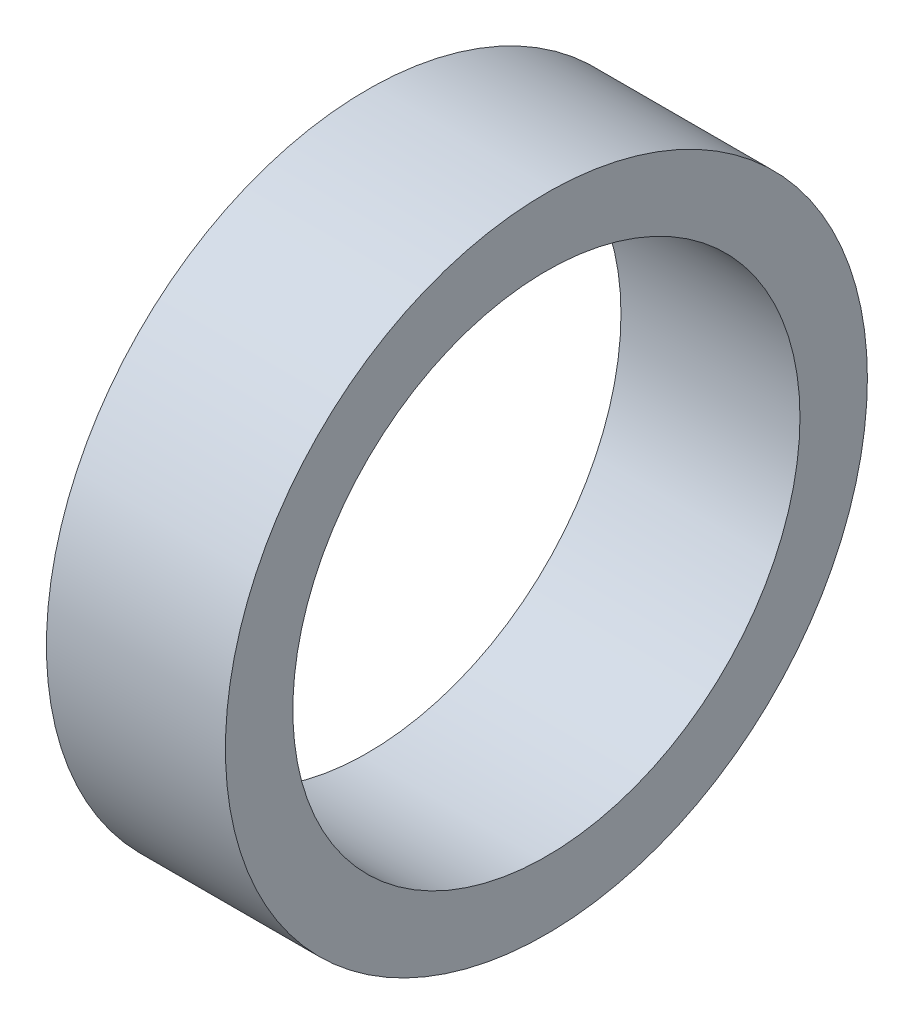
ISO-10303-21;
HEADER;
FILE_DESCRIPTION(('STEP AP214'),'2;1');
FILE_NAME('part.step','',(''),(''),'','','');
FILE_SCHEMA(('AUTOMOTIVE_DESIGN { 1 0 10303 214 1 1 1 1 }'));
ENDSEC;
DATA;
#1=APPLICATION_CONTEXT('core data for automotive mechanical design processes');
#2=APPLICATION_PROTOCOL_DEFINITION('international standard','automotive_design',2000,#1);
#3=PRODUCT_CONTEXT('',#1,'mechanical');
#4=PRODUCT('Part','Part','',(#3));
#5=PRODUCT_RELATED_PRODUCT_CATEGORY('part','',(#4));
#6=PRODUCT_DEFINITION_FORMATION('','',#4);
#7=PRODUCT_DEFINITION_CONTEXT('part definition',#1,'design');
#8=PRODUCT_DEFINITION('design','',#6,#7);
#9=PRODUCT_DEFINITION_SHAPE('','',#8);
#10=(LENGTH_UNIT() NAMED_UNIT(*) SI_UNIT(.MILLI.,.METRE.));
#11=(NAMED_UNIT(*) PLANE_ANGLE_UNIT() SI_UNIT($,.RADIAN.));
#12=(NAMED_UNIT(*) SI_UNIT($,.STERADIAN.) SOLID_ANGLE_UNIT());
#13=UNCERTAINTY_MEASURE_WITH_UNIT(LENGTH_MEASURE(1.E-05),#10,'distance_accuracy_value','');
#14=(GEOMETRIC_REPRESENTATION_CONTEXT(3) GLOBAL_UNCERTAINTY_ASSIGNED_CONTEXT((#13)) GLOBAL_UNIT_ASSIGNED_CONTEXT((#10,
#11,#12)) REPRESENTATION_CONTEXT('',''));
#15=CARTESIAN_POINT('',(0.,0.,0.));
#16=DIRECTION('',(0.,0.,1.));
#17=DIRECTION('',(1.,0.,0.));
#18=AXIS2_PLACEMENT_3D('',#15,#16,#17);
#19=CARTESIAN_POINT('',(0.,0.,0.));
#20=DIRECTION('',(1.,0.,0.));
#21=DIRECTION('',(0.,0.,-1.));
#22=AXIS2_PLACEMENT_3D('',#19,#20,#21);
#23=PLANE('',#22);
#24=CARTESIAN_POINT('',(0.,0.,0.));
#25=DIRECTION('',(1.,0.,0.));
#26=DIRECTION('',(0.,0.,-1.));
#27=AXIS2_PLACEMENT_3D('',#24,#25,#26);
#28=CIRCLE('',#27,53.8);
#29=CARTESIAN_POINT('',(0.,0.,-53.8));
#30=VERTEX_POINT('',#29);
#31=EDGE_CURVE('E10',#30,#30,#28,.T.);
#32=ORIENTED_EDGE('',*,*,#31,.F.);
#33=EDGE_LOOP('',(#32));
#34=FACE_BOUND('',#33,.T.);
#35=CARTESIAN_POINT('',(0.,0.,0.));
#36=DIRECTION('',(1.,0.,0.));
#37=DIRECTION('',(0.,0.,-1.));
#38=AXIS2_PLACEMENT_3D('',#35,#36,#37);
#39=CIRCLE('',#38,42.5);
#40=CARTESIAN_POINT('',(0.,0.,-42.5));
#41=VERTEX_POINT('',#40);
#42=EDGE_CURVE('E49',#41,#41,#39,.T.);
#43=ORIENTED_EDGE('',*,*,#42,.T.);
#44=EDGE_LOOP('',(#43));
#45=FACE_BOUND('',#44,.T.);
#46=CARTESIAN_POINT('',(0.,48.,0.));
#47=DIRECTION('',(1.,0.,0.));
#48=DIRECTION('',(0.,0.,-1.));
#49=AXIS2_PLACEMENT_3D('',#46,#47,#48);
#50=CIRCLE('',#49,2.8);
#51=CARTESIAN_POINT('',(0.,48.,-2.8));
#52=VERTEX_POINT('',#51);
#53=EDGE_CURVE('E54',#52,#52,#50,.T.);
#54=ORIENTED_EDGE('',*,*,#53,.T.);
#55=EDGE_LOOP('',(#54));
#56=FACE_BOUND('',#55,.T.);
#57=CARTESIAN_POINT('',(0.,2.55293774870495E-12,-48.0000000000026));
#58=DIRECTION('',(1.,0.,0.));
#59=DIRECTION('',(0.,0.,-1.));
#60=AXIS2_PLACEMENT_3D('',#57,#58,#59);
#61=CIRCLE('',#60,2.8);
#62=CARTESIAN_POINT('',(0.,2.55293774870495E-12,-50.8000000000026));
#63=VERTEX_POINT('',#62);
#64=EDGE_CURVE('E59',#63,#63,#61,.T.);
#65=ORIENTED_EDGE('',*,*,#64,.T.);
#66=EDGE_LOOP('',(#65));
#67=FACE_BOUND('',#66,.T.);
#68=CARTESIAN_POINT('',(0.,-48.,-5.1058754974099E-12));
#69=DIRECTION('',(1.,0.,0.));
#70=DIRECTION('',(0.,0.,-1.));
#71=AXIS2_PLACEMENT_3D('',#68,#69,#70);
#72=CIRCLE('',#71,2.8);
#73=CARTESIAN_POINT('',(0.,-48.,-2.80000000000511));
#74=VERTEX_POINT('',#73);
#75=EDGE_CURVE('E71',#74,#74,#72,.T.);
#76=ORIENTED_EDGE('',*,*,#75,.T.);
#77=EDGE_LOOP('',(#76));
#78=FACE_BOUND('',#77,.T.);
#79=CARTESIAN_POINT('',(0.,-2.55881605334086E-12,47.9999999999975));
#80=DIRECTION('',(1.,0.,0.));
#81=DIRECTION('',(0.,0.,-1.));
#82=AXIS2_PLACEMENT_3D('',#79,#80,#81);
#83=CIRCLE('',#82,2.8);
#84=CARTESIAN_POINT('',(0.,-2.55881605334086E-12,45.1999999999975));
#85=VERTEX_POINT('',#84);
#86=EDGE_CURVE('E79',#85,#85,#83,.T.);
#87=ORIENTED_EDGE('',*,*,#86,.T.);
#88=EDGE_LOOP('',(#87));
#89=FACE_BOUND('',#88,.T.);
#90=ADVANCED_FACE('F41',(#34,#45,#56,#67,#78,#89),#23,.F.);
#91=CARTESIAN_POINT('',(20.,0.,0.));
#92=DIRECTION('',(-1.,0.,0.));
#93=DIRECTION('',(0.,0.,1.));
#94=AXIS2_PLACEMENT_3D('',#91,#92,#93);
#95=CYLINDRICAL_SURFACE('',#94,53.8);
#96=ORIENTED_EDGE('',*,*,#31,.T.);
#97=EDGE_LOOP('',(#96));
#98=FACE_BOUND('',#97,.T.);
#99=CARTESIAN_POINT('',(30.,0.,0.));
#100=DIRECTION('',(1.,0.,0.));
#101=DIRECTION('',(0.,0.,-1.));
#102=AXIS2_PLACEMENT_3D('',#99,#100,#101);
#103=CIRCLE('',#102,53.8);
#104=CARTESIAN_POINT('',(30.,0.,-53.8));
#105=VERTEX_POINT('',#104);
#106=EDGE_CURVE('E89',#105,#105,#103,.T.);
#107=ORIENTED_EDGE('',*,*,#106,.F.);
#108=EDGE_LOOP('',(#107));
#109=FACE_BOUND('',#108,.T.);
#110=ADVANCED_FACE('F43',(#98,#109),#95,.T.);
#111=CARTESIAN_POINT('',(20.,0.,0.));
#112=DIRECTION('',(-1.,0.,0.));
#113=DIRECTION('',(0.,0.,1.));
#114=AXIS2_PLACEMENT_3D('',#111,#112,#113);
#115=CYLINDRICAL_SURFACE('',#114,42.5);
#116=ORIENTED_EDGE('',*,*,#42,.F.);
#117=EDGE_LOOP('',(#116));
#118=FACE_BOUND('',#117,.T.);
#119=CARTESIAN_POINT('',(30.,0.,0.));
#120=DIRECTION('',(1.,0.,0.));
#121=DIRECTION('',(0.,0.,-1.));
#122=AXIS2_PLACEMENT_3D('',#119,#120,#121);
#123=CIRCLE('',#122,42.5);
#124=CARTESIAN_POINT('',(30.,0.,-42.5));
#125=VERTEX_POINT('',#124);
#126=EDGE_CURVE('E93',#125,#125,#123,.T.);
#127=ORIENTED_EDGE('',*,*,#126,.T.);
#128=EDGE_LOOP('',(#127));
#129=FACE_BOUND('',#128,.T.);
#130=ADVANCED_FACE('F98',(#118,#129),#115,.F.);
#131=CARTESIAN_POINT('',(20.,48.,0.));
#132=DIRECTION('',(-1.,0.,0.));
#133=DIRECTION('',(0.,0.,1.));
#134=AXIS2_PLACEMENT_3D('',#131,#132,#133);
#135=CYLINDRICAL_SURFACE('',#134,2.8);
#136=CARTESIAN_POINT('',(20.,48.,0.));
#137=DIRECTION('',(1.,0.,0.));
#138=DIRECTION('',(0.,0.,-1.));
#139=AXIS2_PLACEMENT_3D('',#136,#137,#138);
#140=CIRCLE('',#139,2.8);
#141=CARTESIAN_POINT('',(20.,48.,-2.8));
#142=VERTEX_POINT('',#141);
#143=EDGE_CURVE('E62',#142,#142,#140,.T.);
#144=ORIENTED_EDGE('',*,*,#143,.T.);
#145=EDGE_LOOP('',(#144));
#146=FACE_BOUND('',#145,.T.);
#147=ORIENTED_EDGE('',*,*,#53,.F.);
#148=EDGE_LOOP('',(#147));
#149=FACE_BOUND('',#148,.T.);
#150=ADVANCED_FACE('F120',(#146,#149),#135,.F.);
#151=CARTESIAN_POINT('',(20.,2.55293774870495E-12,-48.0000000000026));
#152=DIRECTION('',(-1.,0.,0.));
#153=DIRECTION('',(0.,0.,1.));
#154=AXIS2_PLACEMENT_3D('',#151,#152,#153);
#155=CYLINDRICAL_SURFACE('',#154,2.8);
#156=CARTESIAN_POINT('',(20.,2.55293774870495E-12,-48.0000000000026));
#157=DIRECTION('',(1.,0.,0.));
#158=DIRECTION('',(0.,0.,-1.));
#159=AXIS2_PLACEMENT_3D('',#156,#157,#158);
#160=CIRCLE('',#159,2.8);
#161=CARTESIAN_POINT('',(20.,2.55293774870495E-12,-50.8000000000026));
#162=VERTEX_POINT('',#161);
#163=EDGE_CURVE('E67',#162,#162,#160,.T.);
#164=ORIENTED_EDGE('',*,*,#163,.T.);
#165=EDGE_LOOP('',(#164));
#166=FACE_BOUND('',#165,.T.);
#167=ORIENTED_EDGE('',*,*,#64,.F.);
#168=EDGE_LOOP('',(#167));
#169=FACE_BOUND('',#168,.T.);
#170=ADVANCED_FACE('F124',(#166,#169),#155,.F.);
#171=CARTESIAN_POINT('',(20.,-48.,-5.1058754974099E-12));
#172=DIRECTION('',(-1.,0.,0.));
#173=DIRECTION('',(0.,0.,1.));
#174=AXIS2_PLACEMENT_3D('',#171,#172,#173);
#175=CYLINDRICAL_SURFACE('',#174,2.8);
#176=CARTESIAN_POINT('',(20.,-48.,-5.1058754974099E-12));
#177=DIRECTION('',(1.,0.,0.));
#178=DIRECTION('',(0.,0.,-1.));
#179=AXIS2_PLACEMENT_3D('',#176,#177,#178);
#180=CIRCLE('',#179,2.8);
#181=CARTESIAN_POINT('',(20.,-48.,-2.80000000000511));
#182=VERTEX_POINT('',#181);
#183=EDGE_CURVE('E66',#182,#182,#180,.T.);
#184=ORIENTED_EDGE('',*,*,#183,.T.);
#185=EDGE_LOOP('',(#184));
#186=FACE_BOUND('',#185,.T.);
#187=ORIENTED_EDGE('',*,*,#75,.F.);
#188=EDGE_LOOP('',(#187));
#189=FACE_BOUND('',#188,.T.);
#190=ADVANCED_FACE('F128',(#186,#189),#175,.F.);
#191=CARTESIAN_POINT('',(20.,-2.55881605334086E-12,47.9999999999975));
#192=DIRECTION('',(-1.,0.,0.));
#193=DIRECTION('',(0.,0.,1.));
#194=AXIS2_PLACEMENT_3D('',#191,#192,#193);
#195=CYLINDRICAL_SURFACE('',#194,2.8);
#196=CARTESIAN_POINT('',(20.,-2.55881605334086E-12,47.9999999999975));
#197=DIRECTION('',(1.,0.,0.));
#198=DIRECTION('',(0.,0.,-1.));
#199=AXIS2_PLACEMENT_3D('',#196,#197,#198);
#200=CIRCLE('',#199,2.8);
#201=CARTESIAN_POINT('',(20.,-2.55881605334086E-12,45.1999999999975));
#202=VERTEX_POINT('',#201);
#203=EDGE_CURVE('E75',#202,#202,#200,.T.);
#204=ORIENTED_EDGE('',*,*,#203,.T.);
#205=EDGE_LOOP('',(#204));
#206=FACE_BOUND('',#205,.T.);
#207=ORIENTED_EDGE('',*,*,#86,.F.);
#208=EDGE_LOOP('',(#207));
#209=FACE_BOUND('',#208,.T.);
#210=ADVANCED_FACE('F132',(#206,#209),#195,.F.);
#211=CARTESIAN_POINT('',(20.,0.,0.));
#212=DIRECTION('',(1.,0.,0.));
#213=DIRECTION('',(0.,0.,-1.));
#214=AXIS2_PLACEMENT_3D('',#211,#212,#213);
#215=PLANE('',#214);
#216=ORIENTED_EDGE('',*,*,#203,.F.);
#217=EDGE_LOOP('',(#216));
#218=FACE_BOUND('',#217,.T.);
#219=ADVANCED_FACE('F111',(#218),#215,.F.);
#220=ORIENTED_EDGE('',*,*,#163,.F.);
#221=EDGE_LOOP('',(#220));
#222=FACE_BOUND('',#221,.T.);
#223=ADVANCED_FACE('F139',(#222),#215,.F.);
#224=ORIENTED_EDGE('',*,*,#143,.F.);
#225=EDGE_LOOP('',(#224));
#226=FACE_BOUND('',#225,.T.);
#227=ADVANCED_FACE('F108',(#226),#215,.F.);
#228=ORIENTED_EDGE('',*,*,#183,.F.);
#229=EDGE_LOOP('',(#228));
#230=FACE_BOUND('',#229,.T.);
#231=ADVANCED_FACE('F102',(#230),#215,.F.);
#232=CARTESIAN_POINT('',(30.,0.,0.));
#233=DIRECTION('',(1.,0.,0.));
#234=DIRECTION('',(0.,0.,-1.));
#235=AXIS2_PLACEMENT_3D('',#232,#233,#234);
#236=PLANE('',#235);
#237=ORIENTED_EDGE('',*,*,#106,.T.);
#238=EDGE_LOOP('',(#237));
#239=FACE_BOUND('',#238,.T.);
#240=ORIENTED_EDGE('',*,*,#126,.F.);
#241=EDGE_LOOP('',(#240));
#242=FACE_BOUND('',#241,.T.);
#243=ADVANCED_FACE('F100',(#239,#242),#236,.T.);
#244=CLOSED_SHELL('',(#90,#110,#130,#150,#170,#190,#210,#219,#223,#227,#231,#243));
#245=MANIFOLD_SOLID_BREP('B2',#244);
#246=ADVANCED_BREP_SHAPE_REPRESENTATION('',(#18,#245),#14);
#247=SHAPE_DEFINITION_REPRESENTATION(#9,#246);
ENDSEC;
END-ISO-10303-21;
